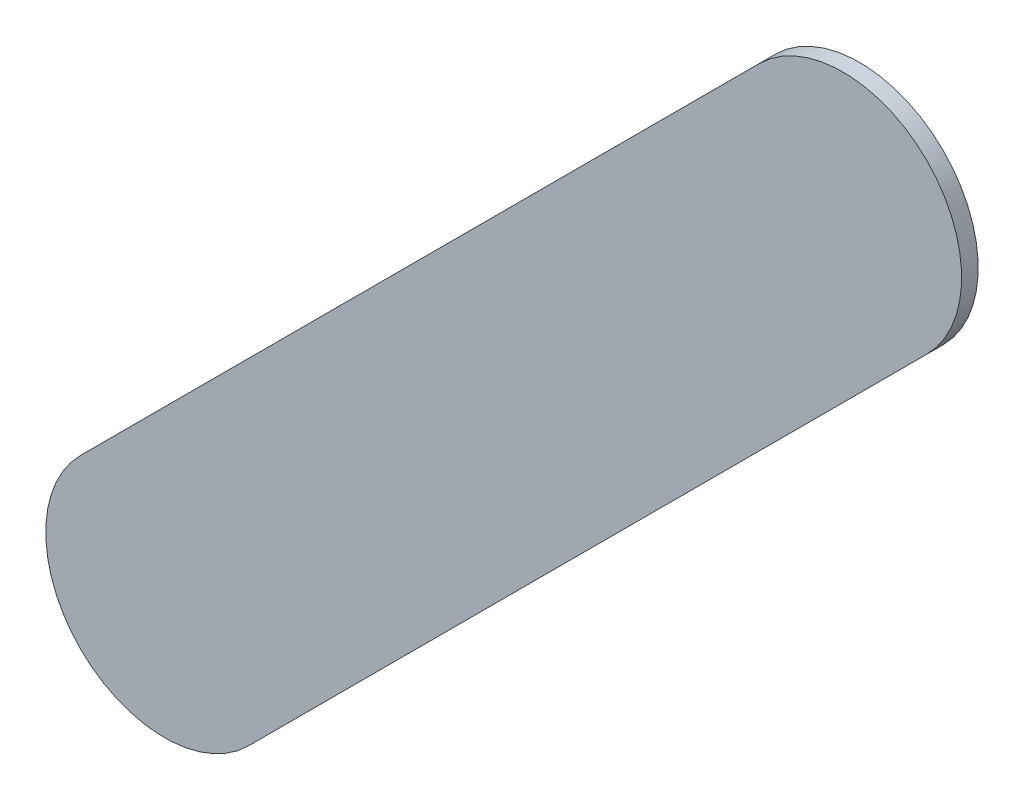
ISO-10303-21;
HEADER;
FILE_DESCRIPTION(('STEP AP214'),'2;1');
FILE_NAME('part.step','',(''),(''),'','','');
FILE_SCHEMA(('AUTOMOTIVE_DESIGN { 1 0 10303 214 1 1 1 1 }'));
ENDSEC;
DATA;
#1=APPLICATION_CONTEXT('core data for automotive mechanical design processes');
#2=APPLICATION_PROTOCOL_DEFINITION('international standard','automotive_design',2000,#1);
#3=PRODUCT_CONTEXT('',#1,'mechanical');
#4=PRODUCT('Part','Part','',(#3));
#5=PRODUCT_RELATED_PRODUCT_CATEGORY('part','',(#4));
#6=PRODUCT_DEFINITION_FORMATION('','',#4);
#7=PRODUCT_DEFINITION_CONTEXT('part definition',#1,'design');
#8=PRODUCT_DEFINITION('design','',#6,#7);
#9=PRODUCT_DEFINITION_SHAPE('','',#8);
#10=(LENGTH_UNIT() NAMED_UNIT(*) SI_UNIT(.MILLI.,.METRE.));
#11=(NAMED_UNIT(*) PLANE_ANGLE_UNIT() SI_UNIT($,.RADIAN.));
#12=(NAMED_UNIT(*) SI_UNIT($,.STERADIAN.) SOLID_ANGLE_UNIT());
#13=UNCERTAINTY_MEASURE_WITH_UNIT(LENGTH_MEASURE(1.E-05),#10,'distance_accuracy_value','');
#14=(GEOMETRIC_REPRESENTATION_CONTEXT(3) GLOBAL_UNCERTAINTY_ASSIGNED_CONTEXT((#13)) GLOBAL_UNIT_ASSIGNED_CONTEXT((#10,
#11,#12)) REPRESENTATION_CONTEXT('',''));
#15=CARTESIAN_POINT('',(0.,0.,0.));
#16=DIRECTION('',(0.,0.,1.));
#17=DIRECTION('',(1.,0.,0.));
#18=AXIS2_PLACEMENT_3D('',#15,#16,#17);
#19=CARTESIAN_POINT('',(97.896776,-84.876776,1.635));
#20=DIRECTION('',(0.,0.,1.));
#21=DIRECTION('',(1.,0.,0.));
#22=AXIS2_PLACEMENT_3D('',#19,#20,#21);
#23=PLANE('',#22);
#24=DIRECTION('',(0.707106781186548,0.707106781186548,0.));
#25=VECTOR('',#24,1.);
#26=CARTESIAN_POINT('',(97.896776,-84.876776,1.635));
#27=LINE('',#26,#25);
#28=CARTESIAN_POINT('',(97.896776,-84.876776,1.635));
#29=VERTEX_POINT('',#28);
#30=CARTESIAN_POINT('',(99.326776,-83.446776,1.635));
#31=VERTEX_POINT('',#30);
#32=EDGE_CURVE('E62',#29,#31,#27,.T.);
#33=ORIENTED_EDGE('',*,*,#32,.T.);
#34=CARTESIAN_POINT('',(99.1499995,-83.2699995,1.635));
#35=DIRECTION('',(0.,0.,1.));
#36=DIRECTION('',(0.707106781186548,-0.707106781186548,0.));
#37=AXIS2_PLACEMENT_3D('',#34,#35,#36);
#38=CIRCLE('',#37,0.249999723809);
#39=CARTESIAN_POINT('',(98.973223,-83.093223,1.635));
#40=VERTEX_POINT('',#39);
#41=EDGE_CURVE('E98',#31,#40,#38,.T.);
#42=ORIENTED_EDGE('',*,*,#41,.T.);
#43=DIRECTION('',(-0.707106781186548,-0.707106781186548,0.));
#44=VECTOR('',#43,1.);
#45=CARTESIAN_POINT('',(98.973223,-83.093223,1.635));
#46=LINE('',#45,#44);
#47=CARTESIAN_POINT('',(97.543223,-84.523223,1.635));
#48=VERTEX_POINT('',#47);
#49=EDGE_CURVE('E65',#40,#48,#46,.T.);
#50=ORIENTED_EDGE('',*,*,#49,.T.);
#51=CARTESIAN_POINT('',(97.7199995,-84.6999995,1.635));
#52=DIRECTION('',(0.,0.,1.));
#53=DIRECTION('',(-0.707106781186548,0.707106781186548,0.));
#54=AXIS2_PLACEMENT_3D('',#51,#52,#53);
#55=CIRCLE('',#54,0.249999723809);
#56=EDGE_CURVE('E11',#48,#29,#55,.T.);
#57=ORIENTED_EDGE('',*,*,#56,.T.);
#58=EDGE_LOOP('',(#33,#42,#50,#57));
#59=FACE_BOUND('',#58,.T.);
#60=ADVANCED_FACE('F17',(#59),#23,.T.);
#61=CARTESIAN_POINT('',(97.896776,-84.876776,1.6));
#62=DIRECTION('',(0.,0.,1.));
#63=DIRECTION('',(1.,0.,0.));
#64=AXIS2_PLACEMENT_3D('',#61,#62,#63);
#65=PLANE('',#64);
#66=CARTESIAN_POINT('',(97.7199995,-84.6999995,1.6));
#67=DIRECTION('',(0.,0.,1.));
#68=DIRECTION('',(-0.707106781186548,0.707106781186548,0.));
#69=AXIS2_PLACEMENT_3D('',#66,#67,#68);
#70=CIRCLE('',#69,0.249999723809);
#71=CARTESIAN_POINT('',(97.543223,-84.523223,1.6));
#72=VERTEX_POINT('',#71);
#73=CARTESIAN_POINT('',(97.896776,-84.876776,1.6));
#74=VERTEX_POINT('',#73);
#75=EDGE_CURVE('E20',#72,#74,#70,.T.);
#76=ORIENTED_EDGE('',*,*,#75,.F.);
#77=DIRECTION('',(-0.707106781186548,-0.707106781186548,0.));
#78=VECTOR('',#77,1.);
#79=CARTESIAN_POINT('',(98.973223,-83.093223,1.6));
#80=LINE('',#79,#78);
#81=CARTESIAN_POINT('',(98.973223,-83.093223,1.6));
#82=VERTEX_POINT('',#81);
#83=EDGE_CURVE('E90',#82,#72,#80,.T.);
#84=ORIENTED_EDGE('',*,*,#83,.F.);
#85=CARTESIAN_POINT('',(99.1499995,-83.2699995,1.6));
#86=DIRECTION('',(0.,0.,1.));
#87=DIRECTION('',(0.707106781186548,-0.707106781186548,0.));
#88=AXIS2_PLACEMENT_3D('',#85,#86,#87);
#89=CIRCLE('',#88,0.249999723809);
#90=CARTESIAN_POINT('',(99.326776,-83.446776,1.6));
#91=VERTEX_POINT('',#90);
#92=EDGE_CURVE('E75',#91,#82,#89,.T.);
#93=ORIENTED_EDGE('',*,*,#92,.F.);
#94=DIRECTION('',(0.707106781186548,0.707106781186548,0.));
#95=VECTOR('',#94,1.);
#96=CARTESIAN_POINT('',(97.896776,-84.876776,1.6));
#97=LINE('',#96,#95);
#98=EDGE_CURVE('E86',#74,#91,#97,.T.);
#99=ORIENTED_EDGE('',*,*,#98,.F.);
#100=EDGE_LOOP('',(#76,#84,#93,#99));
#101=FACE_BOUND('',#100,.T.);
#102=ADVANCED_FACE('F150',(#101),#65,.F.);
#103=CARTESIAN_POINT('',(97.7199995,-84.6999995,1.6));
#104=DIRECTION('',(0.,0.,-1.));
#105=DIRECTION('',(-0.707106781186548,0.707106781186548,0.));
#106=AXIS2_PLACEMENT_3D('',#103,#104,#105);
#107=CYLINDRICAL_SURFACE('',#106,0.249999723809);
#108=ORIENTED_EDGE('',*,*,#75,.T.);
#109=DIRECTION('',(0.,0.,1.));
#110=VECTOR('',#109,1.);
#111=CARTESIAN_POINT('',(97.896776,-84.876776,1.6));
#112=LINE('',#111,#110);
#113=EDGE_CURVE('E69',#74,#29,#112,.T.);
#114=ORIENTED_EDGE('',*,*,#113,.T.);
#115=ORIENTED_EDGE('',*,*,#56,.F.);
#116=DIRECTION('',(0.,0.,1.));
#117=VECTOR('',#116,1.);
#118=CARTESIAN_POINT('',(97.543223,-84.523223,1.6));
#119=LINE('',#118,#117);
#120=EDGE_CURVE('E101',#72,#48,#119,.T.);
#121=ORIENTED_EDGE('',*,*,#120,.F.);
#122=EDGE_LOOP('',(#108,#114,#115,#121));
#123=FACE_BOUND('',#122,.T.);
#124=ADVANCED_FACE('F70',(#123),#107,.T.);
#125=CARTESIAN_POINT('',(98.973223,-83.093223,1.6));
#126=DIRECTION('',(0.707106781186548,-0.707106781186548,0.));
#127=DIRECTION('',(0.,0.,-1.));
#128=AXIS2_PLACEMENT_3D('',#125,#126,#127);
#129=PLANE('',#128);
#130=ORIENTED_EDGE('',*,*,#83,.T.);
#131=ORIENTED_EDGE('',*,*,#120,.T.);
#132=ORIENTED_EDGE('',*,*,#49,.F.);
#133=DIRECTION('',(0.,0.,1.));
#134=VECTOR('',#133,1.);
#135=CARTESIAN_POINT('',(98.973223,-83.093223,1.6));
#136=LINE('',#135,#134);
#137=EDGE_CURVE('E94',#82,#40,#136,.T.);
#138=ORIENTED_EDGE('',*,*,#137,.F.);
#139=EDGE_LOOP('',(#130,#131,#132,#138));
#140=FACE_BOUND('',#139,.T.);
#141=ADVANCED_FACE('F131',(#140),#129,.F.);
#142=CARTESIAN_POINT('',(99.1499995,-83.2699995,1.6));
#143=DIRECTION('',(0.,0.,-1.));
#144=DIRECTION('',(0.707106781186548,-0.707106781186548,0.));
#145=AXIS2_PLACEMENT_3D('',#142,#143,#144);
#146=CYLINDRICAL_SURFACE('',#145,0.249999723809);
#147=ORIENTED_EDGE('',*,*,#92,.T.);
#148=ORIENTED_EDGE('',*,*,#137,.T.);
#149=ORIENTED_EDGE('',*,*,#41,.F.);
#150=DIRECTION('',(0.,0.,1.));
#151=VECTOR('',#150,1.);
#152=CARTESIAN_POINT('',(99.326776,-83.446776,1.6));
#153=LINE('',#152,#151);
#154=EDGE_CURVE('E79',#91,#31,#153,.T.);
#155=ORIENTED_EDGE('',*,*,#154,.F.);
#156=EDGE_LOOP('',(#147,#148,#149,#155));
#157=FACE_BOUND('',#156,.T.);
#158=ADVANCED_FACE('F121',(#157),#146,.T.);
#159=CARTESIAN_POINT('',(97.896776,-84.876776,1.6));
#160=DIRECTION('',(-0.707106781186548,0.707106781186548,0.));
#161=DIRECTION('',(0.,0.,1.));
#162=AXIS2_PLACEMENT_3D('',#159,#160,#161);
#163=PLANE('',#162);
#164=ORIENTED_EDGE('',*,*,#98,.T.);
#165=ORIENTED_EDGE('',*,*,#154,.T.);
#166=ORIENTED_EDGE('',*,*,#32,.F.);
#167=ORIENTED_EDGE('',*,*,#113,.F.);
#168=EDGE_LOOP('',(#164,#165,#166,#167));
#169=FACE_BOUND('',#168,.T.);
#170=ADVANCED_FACE('F77',(#169),#163,.F.);
#171=CLOSED_SHELL('',(#60,#102,#124,#141,#158,#170));
#172=MANIFOLD_SOLID_BREP('B1',#171);
#173=ADVANCED_BREP_SHAPE_REPRESENTATION('',(#18,#172),#14);
#174=SHAPE_DEFINITION_REPRESENTATION(#9,#173);
ENDSEC;
END-ISO-10303-21;
